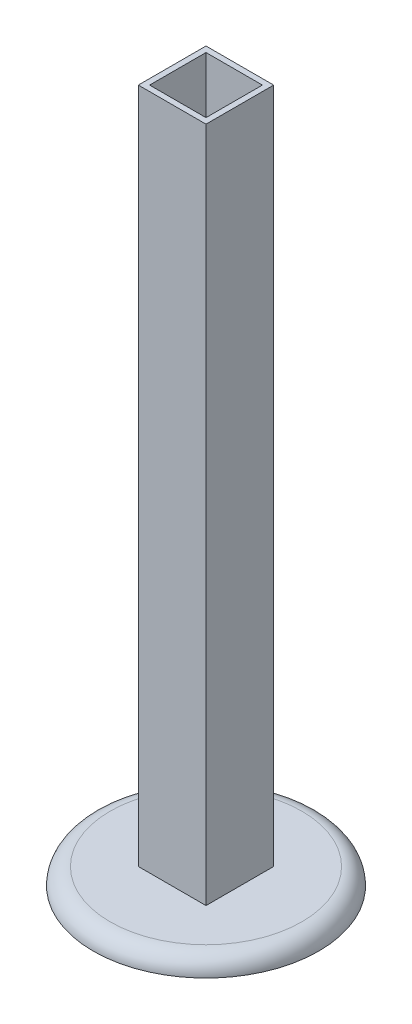
ISO-10303-21;
HEADER;
FILE_DESCRIPTION(('STEP AP214'),'2;1');
FILE_NAME('part.step','',(''),(''),'','','');
FILE_SCHEMA(('AUTOMOTIVE_DESIGN { 1 0 10303 214 1 1 1 1 }'));
ENDSEC;
DATA;
#1=APPLICATION_CONTEXT('core data for automotive mechanical design processes');
#2=APPLICATION_PROTOCOL_DEFINITION('international standard','automotive_design',2000,#1);
#3=PRODUCT_CONTEXT('',#1,'mechanical');
#4=PRODUCT('Part','Part','',(#3));
#5=PRODUCT_RELATED_PRODUCT_CATEGORY('part','',(#4));
#6=PRODUCT_DEFINITION_FORMATION('','',#4);
#7=PRODUCT_DEFINITION_CONTEXT('part definition',#1,'design');
#8=PRODUCT_DEFINITION('design','',#6,#7);
#9=PRODUCT_DEFINITION_SHAPE('','',#8);
#10=(LENGTH_UNIT() NAMED_UNIT(*) SI_UNIT(.MILLI.,.METRE.));
#11=(NAMED_UNIT(*) PLANE_ANGLE_UNIT() SI_UNIT($,.RADIAN.));
#12=(NAMED_UNIT(*) SI_UNIT($,.STERADIAN.) SOLID_ANGLE_UNIT());
#13=UNCERTAINTY_MEASURE_WITH_UNIT(LENGTH_MEASURE(1.E-05),#10,'distance_accuracy_value','');
#14=(GEOMETRIC_REPRESENTATION_CONTEXT(3) GLOBAL_UNCERTAINTY_ASSIGNED_CONTEXT((#13)) GLOBAL_UNIT_ASSIGNED_CONTEXT((#10,
#11,#12)) REPRESENTATION_CONTEXT('',''));
#15=CARTESIAN_POINT('',(0.,0.,0.));
#16=DIRECTION('',(0.,0.,1.));
#17=DIRECTION('',(1.,0.,0.));
#18=AXIS2_PLACEMENT_3D('',#15,#16,#17);
#19=CARTESIAN_POINT('',(0.,1230.,0.));
#20=DIRECTION('',(0.,-1.,0.));
#21=DIRECTION('',(0.,0.,-1.));
#22=AXIS2_PLACEMENT_3D('',#19,#20,#21);
#23=PLANE('',#22);
#24=DIRECTION('',(0.,0.,-1.));
#25=VECTOR('',#24,1.);
#26=CARTESIAN_POINT('',(60.,1230.,60.));
#27=LINE('',#26,#25);
#28=CARTESIAN_POINT('',(60.,1230.,60.));
#29=VERTEX_POINT('',#28);
#30=CARTESIAN_POINT('',(60.,1230.,-60.));
#31=VERTEX_POINT('',#30);
#32=EDGE_CURVE('E142',#29,#31,#27,.T.);
#33=ORIENTED_EDGE('',*,*,#32,.T.);
#34=DIRECTION('',(-1.,0.,0.));
#35=VECTOR('',#34,1.);
#36=CARTESIAN_POINT('',(-60.,1230.,-60.));
#37=LINE('',#36,#35);
#38=CARTESIAN_POINT('',(-60.,1230.,-60.));
#39=VERTEX_POINT('',#38);
#40=EDGE_CURVE('E145',#31,#39,#37,.T.);
#41=ORIENTED_EDGE('',*,*,#40,.T.);
#42=DIRECTION('',(0.,0.,1.));
#43=VECTOR('',#42,1.);
#44=CARTESIAN_POINT('',(-60.,1230.,60.));
#45=LINE('',#44,#43);
#46=CARTESIAN_POINT('',(-60.,1230.,60.));
#47=VERTEX_POINT('',#46);
#48=EDGE_CURVE('E148',#39,#47,#45,.T.);
#49=ORIENTED_EDGE('',*,*,#48,.T.);
#50=DIRECTION('',(1.,0.,0.));
#51=VECTOR('',#50,1.);
#52=CARTESIAN_POINT('',(-60.,1230.,60.));
#53=LINE('',#52,#51);
#54=EDGE_CURVE('E150',#47,#29,#53,.T.);
#55=ORIENTED_EDGE('',*,*,#54,.T.);
#56=EDGE_LOOP('',(#33,#41,#49,#55));
#57=FACE_BOUND('',#56,.T.);
#58=DIRECTION('',(0.,0.,-1.));
#59=VECTOR('',#58,1.);
#60=CARTESIAN_POINT('',(50.,1230.,0.));
#61=LINE('',#60,#59);
#62=CARTESIAN_POINT('',(50.,1230.,50.));
#63=VERTEX_POINT('',#62);
#64=CARTESIAN_POINT('',(50.,1230.,-50.));
#65=VERTEX_POINT('',#64);
#66=EDGE_CURVE('E123',#63,#65,#61,.T.);
#67=ORIENTED_EDGE('',*,*,#66,.F.);
#68=DIRECTION('',(1.,0.,0.));
#69=VECTOR('',#68,1.);
#70=CARTESIAN_POINT('',(0.,1230.,50.));
#71=LINE('',#70,#69);
#72=CARTESIAN_POINT('',(-50.,1230.,50.));
#73=VERTEX_POINT('',#72);
#74=EDGE_CURVE('E134',#73,#63,#71,.T.);
#75=ORIENTED_EDGE('',*,*,#74,.F.);
#76=DIRECTION('',(0.,0.,1.));
#77=VECTOR('',#76,1.);
#78=CARTESIAN_POINT('',(-50.,1230.,0.));
#79=LINE('',#78,#77);
#80=CARTESIAN_POINT('',(-50.,1230.,-50.));
#81=VERTEX_POINT('',#80);
#82=EDGE_CURVE('E139',#81,#73,#79,.T.);
#83=ORIENTED_EDGE('',*,*,#82,.F.);
#84=DIRECTION('',(-1.,0.,0.));
#85=VECTOR('',#84,1.);
#86=CARTESIAN_POINT('',(0.,1230.,-50.));
#87=LINE('',#86,#85);
#88=EDGE_CURVE('E115',#65,#81,#87,.T.);
#89=ORIENTED_EDGE('',*,*,#88,.F.);
#90=EDGE_LOOP('',(#67,#75,#83,#89));
#91=FACE_BOUND('',#90,.T.);
#92=ADVANCED_FACE('F34',(#57,#91),#23,.F.);
#93=CARTESIAN_POINT('',(0.,30.,0.));
#94=DIRECTION('',(0.,1.,0.));
#95=DIRECTION('',(0.,0.,1.));
#96=AXIS2_PLACEMENT_3D('',#93,#94,#95);
#97=PLANE('',#96);
#98=CARTESIAN_POINT('',(0.,30.,0.));
#99=DIRECTION('',(0.,1.,0.));
#100=DIRECTION('',(0.,0.,1.));
#101=AXIS2_PLACEMENT_3D('',#98,#99,#100);
#102=CIRCLE('',#101,170.);
#103=CARTESIAN_POINT('',(0.,30.,170.));
#104=VERTEX_POINT('',#103);
#105=EDGE_CURVE('E11',#104,#104,#102,.T.);
#106=ORIENTED_EDGE('',*,*,#105,.T.);
#107=EDGE_LOOP('',(#106));
#108=FACE_BOUND('',#107,.T.);
#109=DIRECTION('',(-1.,0.,0.));
#110=VECTOR('',#109,1.);
#111=CARTESIAN_POINT('',(-60.,30.,-60.));
#112=LINE('',#111,#110);
#113=CARTESIAN_POINT('',(60.,30.,-60.));
#114=VERTEX_POINT('',#113);
#115=CARTESIAN_POINT('',(-60.,30.,-60.));
#116=VERTEX_POINT('',#115);
#117=EDGE_CURVE('E156',#114,#116,#112,.T.);
#118=ORIENTED_EDGE('',*,*,#117,.F.);
#119=DIRECTION('',(0.,0.,-1.));
#120=VECTOR('',#119,1.);
#121=CARTESIAN_POINT('',(60.,30.,60.));
#122=LINE('',#121,#120);
#123=CARTESIAN_POINT('',(60.,30.,60.));
#124=VERTEX_POINT('',#123);
#125=EDGE_CURVE('E153',#124,#114,#122,.T.);
#126=ORIENTED_EDGE('',*,*,#125,.F.);
#127=DIRECTION('',(1.,0.,0.));
#128=VECTOR('',#127,1.);
#129=CARTESIAN_POINT('',(-60.,30.,60.));
#130=LINE('',#129,#128);
#131=CARTESIAN_POINT('',(-60.,30.,60.));
#132=VERTEX_POINT('',#131);
#133=EDGE_CURVE('E146',#132,#124,#130,.T.);
#134=ORIENTED_EDGE('',*,*,#133,.F.);
#135=DIRECTION('',(0.,0.,1.));
#136=VECTOR('',#135,1.);
#137=CARTESIAN_POINT('',(-60.,30.,60.));
#138=LINE('',#137,#136);
#139=EDGE_CURVE('E158',#116,#132,#138,.T.);
#140=ORIENTED_EDGE('',*,*,#139,.F.);
#141=EDGE_LOOP('',(#118,#126,#134,#140));
#142=FACE_BOUND('',#141,.T.);
#143=ADVANCED_FACE('F175',(#108,#142),#97,.T.);
#144=CARTESIAN_POINT('',(0.,0.,0.));
#145=DIRECTION('',(0.,1.,0.));
#146=DIRECTION('',(0.,0.,1.));
#147=AXIS2_PLACEMENT_3D('',#144,#145,#146);
#148=PLANE('',#147);
#149=CARTESIAN_POINT('',(0.,0.,0.));
#150=DIRECTION('',(0.,1.,0.));
#151=DIRECTION('',(0.,0.,1.));
#152=AXIS2_PLACEMENT_3D('',#149,#150,#151);
#153=CIRCLE('',#152,200.);
#154=CARTESIAN_POINT('',(0.,0.,200.));
#155=VERTEX_POINT('',#154);
#156=EDGE_CURVE('E42',#155,#155,#153,.T.);
#157=ORIENTED_EDGE('',*,*,#156,.F.);
#158=EDGE_LOOP('',(#157));
#159=FACE_BOUND('',#158,.T.);
#160=ADVANCED_FACE('F173',(#159),#148,.F.);
#161=CARTESIAN_POINT('',(0.,0.,0.));
#162=DIRECTION('',(0.,1.,0.));
#163=DIRECTION('',(0.,0.,1.));
#164=AXIS2_PLACEMENT_3D('',#161,#162,#163);
#165=TOROIDAL_SURFACE('',#164,170.,30.);
#166=ORIENTED_EDGE('',*,*,#156,.T.);
#167=EDGE_LOOP('',(#166));
#168=FACE_BOUND('',#167,.T.);
#169=ORIENTED_EDGE('',*,*,#105,.F.);
#170=EDGE_LOOP('',(#169));
#171=FACE_BOUND('',#170,.T.);
#172=ADVANCED_FACE('F36',(#168,#171),#165,.T.);
#173=CARTESIAN_POINT('',(60.,1230.,60.));
#174=DIRECTION('',(-1.,0.,0.));
#175=DIRECTION('',(0.,0.,1.));
#176=AXIS2_PLACEMENT_3D('',#173,#174,#175);
#177=PLANE('',#176);
#178=ORIENTED_EDGE('',*,*,#125,.T.);
#179=DIRECTION('',(0.,-1.,0.));
#180=VECTOR('',#179,1.);
#181=CARTESIAN_POINT('',(60.,1230.,-60.));
#182=LINE('',#181,#180);
#183=EDGE_CURVE('E167',#31,#114,#182,.T.);
#184=ORIENTED_EDGE('',*,*,#183,.F.);
#185=ORIENTED_EDGE('',*,*,#32,.F.);
#186=DIRECTION('',(0.,-1.,0.));
#187=VECTOR('',#186,1.);
#188=CARTESIAN_POINT('',(60.,1230.,60.));
#189=LINE('',#188,#187);
#190=EDGE_CURVE('E152',#29,#124,#189,.T.);
#191=ORIENTED_EDGE('',*,*,#190,.T.);
#192=EDGE_LOOP('',(#178,#184,#185,#191));
#193=FACE_BOUND('',#192,.T.);
#194=ADVANCED_FACE('F180',(#193),#177,.F.);
#195=CARTESIAN_POINT('',(-60.,1230.,-60.));
#196=DIRECTION('',(0.,0.,1.));
#197=DIRECTION('',(1.,0.,0.));
#198=AXIS2_PLACEMENT_3D('',#195,#196,#197);
#199=PLANE('',#198);
#200=ORIENTED_EDGE('',*,*,#117,.T.);
#201=DIRECTION('',(0.,-1.,0.));
#202=VECTOR('',#201,1.);
#203=CARTESIAN_POINT('',(-60.,1230.,-60.));
#204=LINE('',#203,#202);
#205=EDGE_CURVE('E164',#39,#116,#204,.T.);
#206=ORIENTED_EDGE('',*,*,#205,.F.);
#207=ORIENTED_EDGE('',*,*,#40,.F.);
#208=ORIENTED_EDGE('',*,*,#183,.T.);
#209=EDGE_LOOP('',(#200,#206,#207,#208));
#210=FACE_BOUND('',#209,.T.);
#211=ADVANCED_FACE('F199',(#210),#199,.F.);
#212=CARTESIAN_POINT('',(-60.,1230.,60.));
#213=DIRECTION('',(1.,0.,0.));
#214=DIRECTION('',(0.,0.,-1.));
#215=AXIS2_PLACEMENT_3D('',#212,#213,#214);
#216=PLANE('',#215);
#217=ORIENTED_EDGE('',*,*,#139,.T.);
#218=DIRECTION('',(0.,-1.,0.));
#219=VECTOR('',#218,1.);
#220=CARTESIAN_POINT('',(-60.,1230.,60.));
#221=LINE('',#220,#219);
#222=EDGE_CURVE('E57',#47,#132,#221,.T.);
#223=ORIENTED_EDGE('',*,*,#222,.F.);
#224=ORIENTED_EDGE('',*,*,#48,.F.);
#225=ORIENTED_EDGE('',*,*,#205,.T.);
#226=EDGE_LOOP('',(#217,#223,#224,#225));
#227=FACE_BOUND('',#226,.T.);
#228=ADVANCED_FACE('F196',(#227),#216,.F.);
#229=CARTESIAN_POINT('',(-60.,1230.,60.));
#230=DIRECTION('',(0.,0.,-1.));
#231=DIRECTION('',(-1.,0.,0.));
#232=AXIS2_PLACEMENT_3D('',#229,#230,#231);
#233=PLANE('',#232);
#234=ORIENTED_EDGE('',*,*,#133,.T.);
#235=ORIENTED_EDGE('',*,*,#190,.F.);
#236=ORIENTED_EDGE('',*,*,#54,.F.);
#237=ORIENTED_EDGE('',*,*,#222,.T.);
#238=EDGE_LOOP('',(#234,#235,#236,#237));
#239=FACE_BOUND('',#238,.T.);
#240=ADVANCED_FACE('F193',(#239),#233,.F.);
#241=CARTESIAN_POINT('',(0.,20.,0.));
#242=DIRECTION('',(0.,1.,0.));
#243=DIRECTION('',(0.,0.,1.));
#244=AXIS2_PLACEMENT_3D('',#241,#242,#243);
#245=PLANE('',#244);
#246=CARTESIAN_POINT('',(0.,20.,0.));
#247=DIRECTION('',(0.,1.,0.));
#248=DIRECTION('',(0.,0.,1.));
#249=AXIS2_PLACEMENT_3D('',#246,#247,#248);
#250=CIRCLE('',#249,170.);
#251=CARTESIAN_POINT('',(0.,20.,170.));
#252=VERTEX_POINT('',#251);
#253=EDGE_CURVE('E130',#252,#252,#250,.T.);
#254=ORIENTED_EDGE('',*,*,#253,.F.);
#255=EDGE_LOOP('',(#254));
#256=FACE_BOUND('',#255,.T.);
#257=DIRECTION('',(-1.,0.,0.));
#258=VECTOR('',#257,1.);
#259=CARTESIAN_POINT('',(-60.,20.,-50.));
#260=LINE('',#259,#258);
#261=CARTESIAN_POINT('',(50.,20.,-50.));
#262=VERTEX_POINT('',#261);
#263=CARTESIAN_POINT('',(-50.,20.,-50.));
#264=VERTEX_POINT('',#263);
#265=EDGE_CURVE('E101',#262,#264,#260,.T.);
#266=ORIENTED_EDGE('',*,*,#265,.T.);
#267=DIRECTION('',(0.,0.,1.));
#268=VECTOR('',#267,1.);
#269=CARTESIAN_POINT('',(-50.,20.,60.));
#270=LINE('',#269,#268);
#271=CARTESIAN_POINT('',(-50.,20.,50.));
#272=VERTEX_POINT('',#271);
#273=EDGE_CURVE('E105',#264,#272,#270,.T.);
#274=ORIENTED_EDGE('',*,*,#273,.T.);
#275=DIRECTION('',(1.,0.,0.));
#276=VECTOR('',#275,1.);
#277=CARTESIAN_POINT('',(-60.,20.,50.));
#278=LINE('',#277,#276);
#279=CARTESIAN_POINT('',(50.,20.,50.));
#280=VERTEX_POINT('',#279);
#281=EDGE_CURVE('E121',#272,#280,#278,.T.);
#282=ORIENTED_EDGE('',*,*,#281,.T.);
#283=DIRECTION('',(0.,0.,-1.));
#284=VECTOR('',#283,1.);
#285=CARTESIAN_POINT('',(50.,20.,60.));
#286=LINE('',#285,#284);
#287=EDGE_CURVE('E107',#280,#262,#286,.T.);
#288=ORIENTED_EDGE('',*,*,#287,.T.);
#289=EDGE_LOOP('',(#266,#274,#282,#288));
#290=FACE_BOUND('',#289,.T.);
#291=ADVANCED_FACE('F103',(#256,#290),#245,.F.);
#292=CARTESIAN_POINT('',(0.,10.,0.));
#293=DIRECTION('',(0.,1.,0.));
#294=DIRECTION('',(0.,0.,1.));
#295=AXIS2_PLACEMENT_3D('',#292,#293,#294);
#296=PLANE('',#295);
#297=CARTESIAN_POINT('',(0.,10.,0.));
#298=DIRECTION('',(0.,1.,0.));
#299=DIRECTION('',(0.,0.,1.));
#300=AXIS2_PLACEMENT_3D('',#297,#298,#299);
#301=CIRCLE('',#300,187.320508075689);
#302=CARTESIAN_POINT('',(0.,10.,187.320508075689));
#303=VERTEX_POINT('',#302);
#304=EDGE_CURVE('E127',#303,#303,#301,.T.);
#305=ORIENTED_EDGE('',*,*,#304,.T.);
#306=EDGE_LOOP('',(#305));
#307=FACE_BOUND('',#306,.T.);
#308=ADVANCED_FACE('F239',(#307),#296,.T.);
#309=CARTESIAN_POINT('',(0.,0.,0.));
#310=DIRECTION('',(0.,1.,0.));
#311=DIRECTION('',(0.,0.,1.));
#312=AXIS2_PLACEMENT_3D('',#309,#310,#311);
#313=TOROIDAL_SURFACE('',#312,170.,20.);
#314=ORIENTED_EDGE('',*,*,#304,.F.);
#315=EDGE_LOOP('',(#314));
#316=FACE_BOUND('',#315,.T.);
#317=ORIENTED_EDGE('',*,*,#253,.T.);
#318=EDGE_LOOP('',(#317));
#319=FACE_BOUND('',#318,.T.);
#320=ADVANCED_FACE('F247',(#316,#319),#313,.F.);
#321=CARTESIAN_POINT('',(50.,1230.,60.));
#322=DIRECTION('',(-1.,0.,0.));
#323=DIRECTION('',(0.,0.,1.));
#324=AXIS2_PLACEMENT_3D('',#321,#322,#323);
#325=PLANE('',#324);
#326=ORIENTED_EDGE('',*,*,#287,.F.);
#327=DIRECTION('',(0.,-1.,0.));
#328=VECTOR('',#327,1.);
#329=CARTESIAN_POINT('',(50.,1230.,50.));
#330=LINE('',#329,#328);
#331=EDGE_CURVE('E132',#63,#280,#330,.T.);
#332=ORIENTED_EDGE('',*,*,#331,.F.);
#333=ORIENTED_EDGE('',*,*,#66,.T.);
#334=DIRECTION('',(0.,-1.,0.));
#335=VECTOR('',#334,1.);
#336=CARTESIAN_POINT('',(50.,1230.,-50.));
#337=LINE('',#336,#335);
#338=EDGE_CURVE('E118',#65,#262,#337,.T.);
#339=ORIENTED_EDGE('',*,*,#338,.T.);
#340=EDGE_LOOP('',(#326,#332,#333,#339));
#341=FACE_BOUND('',#340,.T.);
#342=ADVANCED_FACE('F255',(#341),#325,.T.);
#343=CARTESIAN_POINT('',(-60.,1230.,-50.));
#344=DIRECTION('',(0.,0.,1.));
#345=DIRECTION('',(1.,0.,0.));
#346=AXIS2_PLACEMENT_3D('',#343,#344,#345);
#347=PLANE('',#346);
#348=ORIENTED_EDGE('',*,*,#265,.F.);
#349=ORIENTED_EDGE('',*,*,#338,.F.);
#350=ORIENTED_EDGE('',*,*,#88,.T.);
#351=DIRECTION('',(0.,-1.,0.));
#352=VECTOR('',#351,1.);
#353=CARTESIAN_POINT('',(-50.,1230.,-50.));
#354=LINE('',#353,#352);
#355=EDGE_CURVE('E112',#81,#264,#354,.T.);
#356=ORIENTED_EDGE('',*,*,#355,.T.);
#357=EDGE_LOOP('',(#348,#349,#350,#356));
#358=FACE_BOUND('',#357,.T.);
#359=ADVANCED_FACE('F113',(#358),#347,.T.);
#360=CARTESIAN_POINT('',(-50.,1230.,60.));
#361=DIRECTION('',(1.,0.,0.));
#362=DIRECTION('',(0.,0.,-1.));
#363=AXIS2_PLACEMENT_3D('',#360,#361,#362);
#364=PLANE('',#363);
#365=ORIENTED_EDGE('',*,*,#273,.F.);
#366=ORIENTED_EDGE('',*,*,#355,.F.);
#367=ORIENTED_EDGE('',*,*,#82,.T.);
#368=DIRECTION('',(0.,-1.,0.));
#369=VECTOR('',#368,1.);
#370=CARTESIAN_POINT('',(-50.,1230.,50.));
#371=LINE('',#370,#369);
#372=EDGE_CURVE('E49',#73,#272,#371,.T.);
#373=ORIENTED_EDGE('',*,*,#372,.T.);
#374=EDGE_LOOP('',(#365,#366,#367,#373));
#375=FACE_BOUND('',#374,.T.);
#376=ADVANCED_FACE('F120',(#375),#364,.T.);
#377=CARTESIAN_POINT('',(-60.,1230.,50.));
#378=DIRECTION('',(0.,0.,-1.));
#379=DIRECTION('',(-1.,0.,0.));
#380=AXIS2_PLACEMENT_3D('',#377,#378,#379);
#381=PLANE('',#380);
#382=ORIENTED_EDGE('',*,*,#281,.F.);
#383=ORIENTED_EDGE('',*,*,#372,.F.);
#384=ORIENTED_EDGE('',*,*,#74,.T.);
#385=ORIENTED_EDGE('',*,*,#331,.T.);
#386=EDGE_LOOP('',(#382,#383,#384,#385));
#387=FACE_BOUND('',#386,.T.);
#388=ADVANCED_FACE('F191',(#387),#381,.T.);
#389=CLOSED_SHELL('',(#92,#143,#160,#172,#194,#211,#228,#240,#291,#308,#320,#342,#359,#376,#388));
#390=MANIFOLD_SOLID_BREP('B2',#389);
#391=ADVANCED_BREP_SHAPE_REPRESENTATION('',(#18,#390),#14);
#392=SHAPE_DEFINITION_REPRESENTATION(#9,#391);
ENDSEC;
END-ISO-10303-21;
